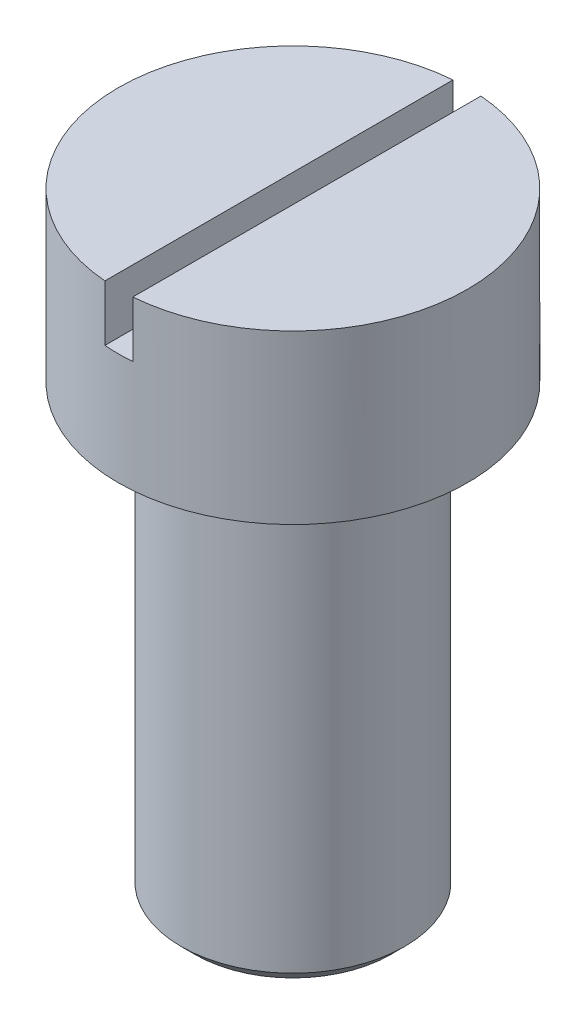
ISO-10303-21;
HEADER;
FILE_DESCRIPTION(('STEP AP214'),'2;1');
FILE_NAME('part.step','',(''),(''),'','','');
FILE_SCHEMA(('AUTOMOTIVE_DESIGN { 1 0 10303 214 1 1 1 1 }'));
ENDSEC;
DATA;
#1=APPLICATION_CONTEXT('core data for automotive mechanical design processes');
#2=APPLICATION_PROTOCOL_DEFINITION('international standard','automotive_design',2000,#1);
#3=PRODUCT_CONTEXT('',#1,'mechanical');
#4=PRODUCT('Part','Part','',(#3));
#5=PRODUCT_RELATED_PRODUCT_CATEGORY('part','',(#4));
#6=PRODUCT_DEFINITION_FORMATION('','',#4);
#7=PRODUCT_DEFINITION_CONTEXT('part definition',#1,'design');
#8=PRODUCT_DEFINITION('design','',#6,#7);
#9=PRODUCT_DEFINITION_SHAPE('','',#8);
#10=(LENGTH_UNIT() NAMED_UNIT(*) SI_UNIT(.MILLI.,.METRE.));
#11=(NAMED_UNIT(*) PLANE_ANGLE_UNIT() SI_UNIT($,.RADIAN.));
#12=(NAMED_UNIT(*) SI_UNIT($,.STERADIAN.) SOLID_ANGLE_UNIT());
#13=UNCERTAINTY_MEASURE_WITH_UNIT(LENGTH_MEASURE(1.E-05),#10,'distance_accuracy_value','');
#14=(GEOMETRIC_REPRESENTATION_CONTEXT(3) GLOBAL_UNCERTAINTY_ASSIGNED_CONTEXT((#13)) GLOBAL_UNIT_ASSIGNED_CONTEXT((#10,
#11,#12)) REPRESENTATION_CONTEXT('',''));
#15=CARTESIAN_POINT('',(0.,0.,0.));
#16=DIRECTION('',(0.,0.,1.));
#17=DIRECTION('',(1.,0.,0.));
#18=AXIS2_PLACEMENT_3D('',#15,#16,#17);
#19=CARTESIAN_POINT('',(0.,12.,0.));
#20=DIRECTION('',(0.,-1.,0.));
#21=DIRECTION('',(0.,0.,-1.));
#22=AXIS2_PLACEMENT_3D('',#19,#20,#21);
#23=CYLINDRICAL_SURFACE('',#22,12.5);
#24=CARTESIAN_POINT('',(0.,0.,0.));
#25=DIRECTION('',(0.,1.,0.));
#26=DIRECTION('',(0.,0.,1.));
#27=AXIS2_PLACEMENT_3D('',#24,#25,#26);
#28=CIRCLE('',#27,12.5);
#29=CARTESIAN_POINT('',(0.,0.,12.5));
#30=VERTEX_POINT('',#29);
#31=EDGE_CURVE('E139',#30,#30,#28,.T.);
#32=ORIENTED_EDGE('',*,*,#31,.T.);
#33=EDGE_LOOP('',(#32));
#34=FACE_BOUND('',#33,.T.);
#35=DIRECTION('',(0.,-1.,0.));
#36=VECTOR('',#35,1.);
#37=CARTESIAN_POINT('',(0.999999999999999,12.,12.4599357943771));
#38=LINE('',#37,#36);
#39=CARTESIAN_POINT('',(1.,8.,12.4599357943771));
#40=VERTEX_POINT('',#39);
#41=CARTESIAN_POINT('',(1.,12.,12.4599357943771));
#42=VERTEX_POINT('',#41);
#43=EDGE_CURVE('E122',#40,#42,#38,.F.);
#44=ORIENTED_EDGE('',*,*,#43,.F.);
#45=CARTESIAN_POINT('',(0.,8.,0.));
#46=DIRECTION('',(0.,-1.,0.));
#47=DIRECTION('',(0.,0.,-1.));
#48=AXIS2_PLACEMENT_3D('',#45,#46,#47);
#49=CIRCLE('',#48,12.5);
#50=CARTESIAN_POINT('',(-1.,8.,12.4599357943771));
#51=VERTEX_POINT('',#50);
#52=EDGE_CURVE('E11',#40,#51,#49,.T.);
#53=ORIENTED_EDGE('',*,*,#52,.T.);
#54=DIRECTION('',(0.,-1.,0.));
#55=VECTOR('',#54,1.);
#56=CARTESIAN_POINT('',(-1.,12.,12.4599357943771));
#57=LINE('',#56,#55);
#58=CARTESIAN_POINT('',(-1.,12.,12.4599357943771));
#59=VERTEX_POINT('',#58);
#60=EDGE_CURVE('E99',#59,#51,#57,.T.);
#61=ORIENTED_EDGE('',*,*,#60,.F.);
#62=CARTESIAN_POINT('',(0.,12.,0.));
#63=DIRECTION('',(0.,-1.,0.));
#64=DIRECTION('',(0.,0.,-1.));
#65=AXIS2_PLACEMENT_3D('',#62,#63,#64);
#66=CIRCLE('',#65,12.5);
#67=CARTESIAN_POINT('',(-1.,12.,-12.4599357943771));
#68=VERTEX_POINT('',#67);
#69=EDGE_CURVE('E62',#68,#59,#66,.F.);
#70=ORIENTED_EDGE('',*,*,#69,.F.);
#71=DIRECTION('',(0.,-1.,0.));
#72=VECTOR('',#71,1.);
#73=CARTESIAN_POINT('',(-1.,12.,-12.4599357943771));
#74=LINE('',#73,#72);
#75=CARTESIAN_POINT('',(-1.,8.,-12.4599357943771));
#76=VERTEX_POINT('',#75);
#77=EDGE_CURVE('E91',#76,#68,#74,.F.);
#78=ORIENTED_EDGE('',*,*,#77,.F.);
#79=CARTESIAN_POINT('',(1.,8.,-12.4599357943771));
#80=VERTEX_POINT('',#79);
#81=EDGE_CURVE('E75',#76,#80,#49,.T.);
#82=ORIENTED_EDGE('',*,*,#81,.T.);
#83=DIRECTION('',(0.,-1.,0.));
#84=VECTOR('',#83,1.);
#85=CARTESIAN_POINT('',(0.999999999999999,12.,-12.4599357943771));
#86=LINE('',#85,#84);
#87=CARTESIAN_POINT('',(1.,12.,-12.4599357943771));
#88=VERTEX_POINT('',#87);
#89=EDGE_CURVE('E109',#88,#80,#86,.T.);
#90=ORIENTED_EDGE('',*,*,#89,.F.);
#91=CARTESIAN_POINT('',(0.,12.,0.));
#92=DIRECTION('',(0.,-1.,0.));
#93=DIRECTION('',(0.,0.,-1.));
#94=AXIS2_PLACEMENT_3D('',#91,#92,#93);
#95=CIRCLE('',#94,12.5);
#96=EDGE_CURVE('E146',#42,#88,#95,.F.);
#97=ORIENTED_EDGE('',*,*,#96,.F.);
#98=EDGE_LOOP('',(#44,#53,#61,#70,#78,#82,#90,#97));
#99=FACE_BOUND('',#98,.T.);
#100=ADVANCED_FACE('F58',(#34,#99),#23,.T.);
#101=CARTESIAN_POINT('',(0.,12.,0.));
#102=DIRECTION('',(0.,1.,0.));
#103=DIRECTION('',(0.,0.,1.));
#104=AXIS2_PLACEMENT_3D('',#101,#102,#103);
#105=PLANE('',#104);
#106=DIRECTION('',(0.,0.,-1.));
#107=VECTOR('',#106,1.);
#108=CARTESIAN_POINT('',(1.,12.,12.5));
#109=LINE('',#108,#107);
#110=EDGE_CURVE('E82',#42,#88,#109,.T.);
#111=ORIENTED_EDGE('',*,*,#110,.F.);
#112=ORIENTED_EDGE('',*,*,#96,.T.);
#113=EDGE_LOOP('',(#111,#112));
#114=FACE_BOUND('',#113,.T.);
#115=ADVANCED_FACE('F165',(#114),#105,.T.);
#116=DIRECTION('',(0.,0.,1.));
#117=VECTOR('',#116,1.);
#118=CARTESIAN_POINT('',(-1.,12.,12.5));
#119=LINE('',#118,#117);
#120=EDGE_CURVE('E151',#68,#59,#119,.T.);
#121=ORIENTED_EDGE('',*,*,#120,.F.);
#122=ORIENTED_EDGE('',*,*,#69,.T.);
#123=EDGE_LOOP('',(#121,#122));
#124=FACE_BOUND('',#123,.T.);
#125=ADVANCED_FACE('F161',(#124),#105,.T.);
#126=CARTESIAN_POINT('',(0.,0.,0.));
#127=DIRECTION('',(0.,1.,0.));
#128=DIRECTION('',(0.,0.,1.));
#129=AXIS2_PLACEMENT_3D('',#126,#127,#128);
#130=PLANE('',#129);
#131=CARTESIAN_POINT('',(0.,0.,0.));
#132=DIRECTION('',(0.,1.,0.));
#133=DIRECTION('',(0.,0.,1.));
#134=AXIS2_PLACEMENT_3D('',#131,#132,#133);
#135=CIRCLE('',#134,8.);
#136=CARTESIAN_POINT('',(0.,0.,8.));
#137=VERTEX_POINT('',#136);
#138=EDGE_CURVE('E117',#137,#137,#135,.T.);
#139=ORIENTED_EDGE('',*,*,#138,.T.);
#140=EDGE_LOOP('',(#139));
#141=FACE_BOUND('',#140,.T.);
#142=ORIENTED_EDGE('',*,*,#31,.F.);
#143=EDGE_LOOP('',(#142));
#144=FACE_BOUND('',#143,.T.);
#145=ADVANCED_FACE('F166',(#141,#144),#130,.F.);
#146=CARTESIAN_POINT('',(0.,-32.,0.));
#147=DIRECTION('',(0.,1.,0.));
#148=DIRECTION('',(0.,0.,1.));
#149=AXIS2_PLACEMENT_3D('',#146,#147,#148);
#150=CYLINDRICAL_SURFACE('',#149,8.);
#151=CARTESIAN_POINT('',(0.,-31.,0.));
#152=DIRECTION('',(0.,1.,0.));
#153=DIRECTION('',(0.,0.,1.));
#154=AXIS2_PLACEMENT_3D('',#151,#152,#153);
#155=CIRCLE('',#154,8.);
#156=CARTESIAN_POINT('',(0.,-31.,8.));
#157=VERTEX_POINT('',#156);
#158=EDGE_CURVE('E141',#157,#157,#155,.T.);
#159=ORIENTED_EDGE('',*,*,#158,.T.);
#160=EDGE_LOOP('',(#159));
#161=FACE_BOUND('',#160,.T.);
#162=ORIENTED_EDGE('',*,*,#138,.F.);
#163=EDGE_LOOP('',(#162));
#164=FACE_BOUND('',#163,.T.);
#165=ADVANCED_FACE('F175',(#161,#164),#150,.T.);
#166=CARTESIAN_POINT('',(0.,-32.,0.));
#167=DIRECTION('',(0.,1.,0.));
#168=DIRECTION('',(0.,0.,1.));
#169=AXIS2_PLACEMENT_3D('',#166,#167,#168);
#170=PLANE('',#169);
#171=CARTESIAN_POINT('',(0.,-32.,0.));
#172=DIRECTION('',(0.,1.,0.));
#173=DIRECTION('',(0.,0.,1.));
#174=AXIS2_PLACEMENT_3D('',#171,#172,#173);
#175=CIRCLE('',#174,6.99999999999999);
#176=CARTESIAN_POINT('',(0.,-32.,6.99999999999999));
#177=VERTEX_POINT('',#176);
#178=EDGE_CURVE('E150',#177,#177,#175,.F.);
#179=ORIENTED_EDGE('',*,*,#178,.T.);
#180=EDGE_LOOP('',(#179));
#181=FACE_BOUND('',#180,.T.);
#182=ADVANCED_FACE('F182',(#181),#170,.F.);
#183=CARTESIAN_POINT('',(0.,-31.,0.));
#184=DIRECTION('',(0.,1.,0.));
#185=DIRECTION('',(0.,0.,1.));
#186=AXIS2_PLACEMENT_3D('',#183,#184,#185);
#187=CONICAL_SURFACE('',#186,8.,0.785398163397452);
#188=ORIENTED_EDGE('',*,*,#178,.F.);
#189=EDGE_LOOP('',(#188));
#190=FACE_BOUND('',#189,.T.);
#191=ORIENTED_EDGE('',*,*,#158,.F.);
#192=EDGE_LOOP('',(#191));
#193=FACE_BOUND('',#192,.T.);
#194=ADVANCED_FACE('F65',(#190,#193),#187,.T.);
#195=CARTESIAN_POINT('',(0.,8.,0.));
#196=DIRECTION('',(0.,-1.,0.));
#197=DIRECTION('',(0.,0.,-1.));
#198=AXIS2_PLACEMENT_3D('',#195,#196,#197);
#199=PLANE('',#198);
#200=DIRECTION('',(0.,0.,-1.));
#201=VECTOR('',#200,1.);
#202=CARTESIAN_POINT('',(1.,8.,12.5));
#203=LINE('',#202,#201);
#204=EDGE_CURVE('E120',#40,#80,#203,.T.);
#205=ORIENTED_EDGE('',*,*,#204,.T.);
#206=ORIENTED_EDGE('',*,*,#81,.F.);
#207=DIRECTION('',(0.,0.,1.));
#208=VECTOR('',#207,1.);
#209=CARTESIAN_POINT('',(-1.,8.,12.5));
#210=LINE('',#209,#208);
#211=EDGE_CURVE('E121',#76,#51,#210,.T.);
#212=ORIENTED_EDGE('',*,*,#211,.T.);
#213=ORIENTED_EDGE('',*,*,#52,.F.);
#214=EDGE_LOOP('',(#205,#206,#212,#213));
#215=FACE_BOUND('',#214,.T.);
#216=ADVANCED_FACE('F123',(#215),#199,.F.);
#217=CARTESIAN_POINT('',(1.,12.000012,12.5));
#218=DIRECTION('',(-1.,0.,0.));
#219=DIRECTION('',(0.,0.,1.));
#220=AXIS2_PLACEMENT_3D('',#217,#218,#219);
#221=PLANE('',#220);
#222=ORIENTED_EDGE('',*,*,#89,.T.);
#223=ORIENTED_EDGE('',*,*,#204,.F.);
#224=ORIENTED_EDGE('',*,*,#43,.T.);
#225=ORIENTED_EDGE('',*,*,#110,.T.);
#226=EDGE_LOOP('',(#222,#223,#224,#225));
#227=FACE_BOUND('',#226,.T.);
#228=ADVANCED_FACE('F116',(#227),#221,.T.);
#229=CARTESIAN_POINT('',(-1.,12.000012,12.5));
#230=DIRECTION('',(1.,0.,0.));
#231=DIRECTION('',(0.,0.,-1.));
#232=AXIS2_PLACEMENT_3D('',#229,#230,#231);
#233=PLANE('',#232);
#234=ORIENTED_EDGE('',*,*,#60,.T.);
#235=ORIENTED_EDGE('',*,*,#211,.F.);
#236=ORIENTED_EDGE('',*,*,#77,.T.);
#237=ORIENTED_EDGE('',*,*,#120,.T.);
#238=EDGE_LOOP('',(#234,#235,#236,#237));
#239=FACE_BOUND('',#238,.T.);
#240=ADVANCED_FACE('F204',(#239),#233,.T.);
#241=CLOSED_SHELL('',(#100,#115,#125,#145,#165,#182,#194,#216,#228,#240));
#242=MANIFOLD_SOLID_BREP('B2',#241);
#243=ADVANCED_BREP_SHAPE_REPRESENTATION('',(#18,#242),#14);
#244=SHAPE_DEFINITION_REPRESENTATION(#9,#243);
ENDSEC;
END-ISO-10303-21;
